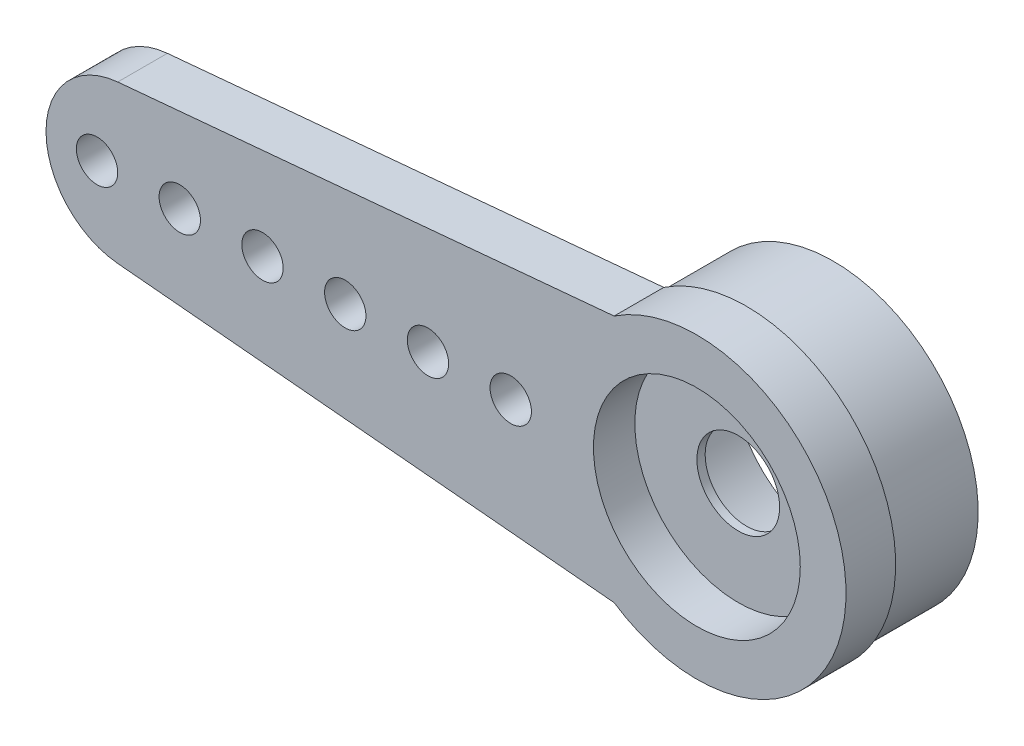
ISO-10303-21;
HEADER;
FILE_DESCRIPTION(('STEP AP214'),'2;1');
FILE_NAME('part.step','',(''),(''),'','','');
FILE_SCHEMA(('AUTOMOTIVE_DESIGN { 1 0 10303 214 1 1 1 1 }'));
ENDSEC;
DATA;
#1=APPLICATION_CONTEXT('core data for automotive mechanical design processes');
#2=APPLICATION_PROTOCOL_DEFINITION('international standard','automotive_design',2000,#1);
#3=PRODUCT_CONTEXT('',#1,'mechanical');
#4=PRODUCT('Part','Part','',(#3));
#5=PRODUCT_RELATED_PRODUCT_CATEGORY('part','',(#4));
#6=PRODUCT_DEFINITION_FORMATION('','',#4);
#7=PRODUCT_DEFINITION_CONTEXT('part definition',#1,'design');
#8=PRODUCT_DEFINITION('design','',#6,#7);
#9=PRODUCT_DEFINITION_SHAPE('','',#8);
#10=(LENGTH_UNIT() NAMED_UNIT(*) SI_UNIT(.MILLI.,.METRE.));
#11=(NAMED_UNIT(*) PLANE_ANGLE_UNIT() SI_UNIT($,.RADIAN.));
#12=(NAMED_UNIT(*) SI_UNIT($,.STERADIAN.) SOLID_ANGLE_UNIT());
#13=UNCERTAINTY_MEASURE_WITH_UNIT(LENGTH_MEASURE(1.E-05),#10,'distance_accuracy_value','');
#14=(GEOMETRIC_REPRESENTATION_CONTEXT(3) GLOBAL_UNCERTAINTY_ASSIGNED_CONTEXT((#13)) GLOBAL_UNIT_ASSIGNED_CONTEXT((#10,
#11,#12)) REPRESENTATION_CONTEXT('',''));
#15=CARTESIAN_POINT('',(0.,0.,0.));
#16=DIRECTION('',(0.,0.,1.));
#17=DIRECTION('',(1.,0.,0.));
#18=AXIS2_PLACEMENT_3D('',#15,#16,#17);
#19=CARTESIAN_POINT('',(0.,0.,-2.1));
#20=DIRECTION('',(0.,0.,1.));
#21=DIRECTION('',(1.,0.,0.));
#22=AXIS2_PLACEMENT_3D('',#19,#20,#21);
#23=CYLINDRICAL_SURFACE('',#22,1.);
#24=CARTESIAN_POINT('',(0.,0.,0.2));
#25=DIRECTION('',(0.,0.,1.));
#26=DIRECTION('',(1.,0.,0.));
#27=AXIS2_PLACEMENT_3D('',#24,#25,#26);
#28=CIRCLE('',#27,1.);
#29=CARTESIAN_POINT('',(1.,0.,0.2));
#30=VERTEX_POINT('',#29);
#31=EDGE_CURVE('E113',#30,#30,#28,.T.);
#32=ORIENTED_EDGE('',*,*,#31,.T.);
#33=EDGE_LOOP('',(#32));
#34=FACE_BOUND('',#33,.T.);
#35=CARTESIAN_POINT('',(0.,0.,0.));
#36=DIRECTION('',(0.,0.,-1.));
#37=DIRECTION('',(-1.,0.,0.));
#38=AXIS2_PLACEMENT_3D('',#35,#36,#37);
#39=CIRCLE('',#38,1.);
#40=CARTESIAN_POINT('',(-1.,0.,0.));
#41=VERTEX_POINT('',#40);
#42=EDGE_CURVE('E110',#41,#41,#39,.F.);
#43=ORIENTED_EDGE('',*,*,#42,.F.);
#44=EDGE_LOOP('',(#43));
#45=FACE_BOUND('',#44,.T.);
#46=ADVANCED_FACE('F36',(#34,#45),#23,.F.);
#47=CARTESIAN_POINT('',(-14.,1.9,1.2));
#48=DIRECTION('',(0.0912839495849539,-0.995824904563132,0.));
#49=DIRECTION('',(0.995824904563132,0.0912839495849539,0.));
#50=AXIS2_PLACEMENT_3D('',#47,#48,#49);
#51=PLANE('',#50);
#52=DIRECTION('',(-0.995824904563132,-0.0912839495849539,0.));
#53=VECTOR('',#52,1.);
#54=CARTESIAN_POINT('',(-14.,1.9,0.));
#55=LINE('',#54,#53);
#56=CARTESIAN_POINT('',(-2.,3.,0.));
#57=VERTEX_POINT('',#56);
#58=CARTESIAN_POINT('',(-14.,1.9,0.));
#59=VERTEX_POINT('',#58);
#60=EDGE_CURVE('E82',#57,#59,#55,.T.);
#61=ORIENTED_EDGE('',*,*,#60,.T.);
#62=DIRECTION('',(0.,0.,-1.));
#63=VECTOR('',#62,1.);
#64=CARTESIAN_POINT('',(-14.,1.9,1.2));
#65=LINE('',#64,#63);
#66=CARTESIAN_POINT('',(-14.,1.9,1.2));
#67=VERTEX_POINT('',#66);
#68=EDGE_CURVE('E107',#67,#59,#65,.T.);
#69=ORIENTED_EDGE('',*,*,#68,.F.);
#70=DIRECTION('',(-0.995824904563132,-0.0912839495849539,0.));
#71=VECTOR('',#70,1.);
#72=CARTESIAN_POINT('',(-14.,1.9,1.2));
#73=LINE('',#72,#71);
#74=CARTESIAN_POINT('',(-2.,3.,1.2));
#75=VERTEX_POINT('',#74);
#76=EDGE_CURVE('E100',#75,#67,#73,.T.);
#77=ORIENTED_EDGE('',*,*,#76,.F.);
#78=DIRECTION('',(0.,0.,-1.));
#79=VECTOR('',#78,1.);
#80=CARTESIAN_POINT('',(-2.,3.,1.2));
#81=LINE('',#80,#79);
#82=EDGE_CURVE('E46',#75,#57,#81,.T.);
#83=ORIENTED_EDGE('',*,*,#82,.T.);
#84=EDGE_LOOP('',(#61,#69,#77,#83));
#85=FACE_BOUND('',#84,.T.);
#86=ADVANCED_FACE('F38',(#85),#51,.F.);
#87=CARTESIAN_POINT('',(-13.8258333333333,0.,1.2));
#88=DIRECTION('',(0.,0.,-1.));
#89=DIRECTION('',(-1.,0.,0.));
#90=AXIS2_PLACEMENT_3D('',#87,#88,#89);
#91=CYLINDRICAL_SURFACE('',#90,1.90796593988933);
#92=CARTESIAN_POINT('',(-13.8258333333333,0.,0.));
#93=DIRECTION('',(0.,0.,1.));
#94=DIRECTION('',(1.,0.,0.));
#95=AXIS2_PLACEMENT_3D('',#92,#93,#94);
#96=CIRCLE('',#95,1.90796593988933);
#97=CARTESIAN_POINT('',(-14.,-1.9,0.));
#98=VERTEX_POINT('',#97);
#99=EDGE_CURVE('E68',#59,#98,#96,.T.);
#100=ORIENTED_EDGE('',*,*,#99,.T.);
#101=DIRECTION('',(0.,0.,-1.));
#102=VECTOR('',#101,1.);
#103=CARTESIAN_POINT('',(-14.,-1.9,1.2));
#104=LINE('',#103,#102);
#105=CARTESIAN_POINT('',(-14.,-1.9,1.2));
#106=VERTEX_POINT('',#105);
#107=EDGE_CURVE('E96',#106,#98,#104,.T.);
#108=ORIENTED_EDGE('',*,*,#107,.F.);
#109=CARTESIAN_POINT('',(-13.8258333333333,0.,1.2));
#110=DIRECTION('',(0.,0.,1.));
#111=DIRECTION('',(1.,0.,0.));
#112=AXIS2_PLACEMENT_3D('',#109,#110,#111);
#113=CIRCLE('',#112,1.90796593988933);
#114=EDGE_CURVE('E55',#67,#106,#113,.T.);
#115=ORIENTED_EDGE('',*,*,#114,.F.);
#116=ORIENTED_EDGE('',*,*,#68,.T.);
#117=EDGE_LOOP('',(#100,#108,#115,#116));
#118=FACE_BOUND('',#117,.T.);
#119=ADVANCED_FACE('F158',(#118),#91,.T.);
#120=CARTESIAN_POINT('',(-14.,-1.9,1.2));
#121=DIRECTION('',(0.0912839495849537,0.995824904563132,0.));
#122=DIRECTION('',(-0.995824904563133,0.0912839495849537,0.));
#123=AXIS2_PLACEMENT_3D('',#120,#121,#122);
#124=PLANE('',#123);
#125=DIRECTION('',(0.995824904563132,-0.0912839495849537,0.));
#126=VECTOR('',#125,1.);
#127=CARTESIAN_POINT('',(-14.,-1.9,0.));
#128=LINE('',#127,#126);
#129=CARTESIAN_POINT('',(-2.,-3.,0.));
#130=VERTEX_POINT('',#129);
#131=EDGE_CURVE('E80',#98,#130,#128,.T.);
#132=ORIENTED_EDGE('',*,*,#131,.T.);
#133=DIRECTION('',(0.,0.,-1.));
#134=VECTOR('',#133,1.);
#135=CARTESIAN_POINT('',(-2.,-3.,1.2));
#136=LINE('',#135,#134);
#137=CARTESIAN_POINT('',(-2.,-3.,1.2));
#138=VERTEX_POINT('',#137);
#139=EDGE_CURVE('E90',#138,#130,#136,.T.);
#140=ORIENTED_EDGE('',*,*,#139,.F.);
#141=DIRECTION('',(0.995824904563132,-0.0912839495849537,0.));
#142=VECTOR('',#141,1.);
#143=CARTESIAN_POINT('',(-14.,-1.9,1.2));
#144=LINE('',#143,#142);
#145=EDGE_CURVE('E97',#106,#138,#144,.T.);
#146=ORIENTED_EDGE('',*,*,#145,.F.);
#147=ORIENTED_EDGE('',*,*,#107,.T.);
#148=EDGE_LOOP('',(#132,#140,#146,#147));
#149=FACE_BOUND('',#148,.T.);
#150=ADVANCED_FACE('F99',(#149),#124,.F.);
#151=CARTESIAN_POINT('',(0.,6.75,1.2));
#152=DIRECTION('',(0.,0.,-1.));
#153=DIRECTION('',(-1.,0.,0.));
#154=AXIS2_PLACEMENT_3D('',#151,#152,#153);
#155=PLANE('',#154);
#156=CARTESIAN_POINT('',(-4.5,0.,1.2));
#157=DIRECTION('',(0.,0.,1.));
#158=DIRECTION('',(1.,0.,0.));
#159=AXIS2_PLACEMENT_3D('',#156,#157,#158);
#160=CIRCLE('',#159,0.5);
#161=CARTESIAN_POINT('',(-4.,0.,1.2));
#162=VERTEX_POINT('',#161);
#163=EDGE_CURVE('E119',#162,#162,#160,.T.);
#164=ORIENTED_EDGE('',*,*,#163,.F.);
#165=EDGE_LOOP('',(#164));
#166=FACE_BOUND('',#165,.T.);
#167=CARTESIAN_POINT('',(-6.5,0.,1.2));
#168=DIRECTION('',(0.,0.,1.));
#169=DIRECTION('',(1.,0.,0.));
#170=AXIS2_PLACEMENT_3D('',#167,#168,#169);
#171=CIRCLE('',#170,0.5);
#172=CARTESIAN_POINT('',(-6.,0.,1.2));
#173=VERTEX_POINT('',#172);
#174=EDGE_CURVE('E169',#173,#173,#171,.T.);
#175=ORIENTED_EDGE('',*,*,#174,.F.);
#176=EDGE_LOOP('',(#175));
#177=FACE_BOUND('',#176,.T.);
#178=CARTESIAN_POINT('',(-8.5,0.,1.2));
#179=DIRECTION('',(0.,0.,1.));
#180=DIRECTION('',(1.,0.,0.));
#181=AXIS2_PLACEMENT_3D('',#178,#179,#180);
#182=CIRCLE('',#181,0.500000000000001);
#183=CARTESIAN_POINT('',(-8.,0.,1.2));
#184=VERTEX_POINT('',#183);
#185=EDGE_CURVE('E172',#184,#184,#182,.T.);
#186=ORIENTED_EDGE('',*,*,#185,.F.);
#187=EDGE_LOOP('',(#186));
#188=FACE_BOUND('',#187,.T.);
#189=CARTESIAN_POINT('',(-10.5,0.,1.2));
#190=DIRECTION('',(0.,0.,1.));
#191=DIRECTION('',(1.,0.,0.));
#192=AXIS2_PLACEMENT_3D('',#189,#190,#191);
#193=CIRCLE('',#192,0.500000000000001);
#194=CARTESIAN_POINT('',(-10.,0.,1.2));
#195=VERTEX_POINT('',#194);
#196=EDGE_CURVE('E175',#195,#195,#193,.T.);
#197=ORIENTED_EDGE('',*,*,#196,.F.);
#198=EDGE_LOOP('',(#197));
#199=FACE_BOUND('',#198,.T.);
#200=CARTESIAN_POINT('',(-12.5,0.,1.2));
#201=DIRECTION('',(0.,0.,1.));
#202=DIRECTION('',(1.,0.,0.));
#203=AXIS2_PLACEMENT_3D('',#200,#201,#202);
#204=CIRCLE('',#203,0.500000000000001);
#205=CARTESIAN_POINT('',(-12.,0.,1.2));
#206=VERTEX_POINT('',#205);
#207=EDGE_CURVE('E165',#206,#206,#204,.T.);
#208=ORIENTED_EDGE('',*,*,#207,.F.);
#209=EDGE_LOOP('',(#208));
#210=FACE_BOUND('',#209,.T.);
#211=CARTESIAN_POINT('',(-14.5,0.,1.2));
#212=DIRECTION('',(0.,0.,1.));
#213=DIRECTION('',(1.,0.,0.));
#214=AXIS2_PLACEMENT_3D('',#211,#212,#213);
#215=CIRCLE('',#214,0.500000000000001);
#216=CARTESIAN_POINT('',(-14.,0.,1.2));
#217=VERTEX_POINT('',#216);
#218=EDGE_CURVE('E162',#217,#217,#215,.T.);
#219=ORIENTED_EDGE('',*,*,#218,.F.);
#220=EDGE_LOOP('',(#219));
#221=FACE_BOUND('',#220,.T.);
#222=CARTESIAN_POINT('',(0.,0.,1.2));
#223=DIRECTION('',(0.,0.,1.));
#224=DIRECTION('',(1.,0.,0.));
#225=AXIS2_PLACEMENT_3D('',#222,#223,#224);
#226=CIRCLE('',#225,2.5);
#227=CARTESIAN_POINT('',(2.5,0.,1.2));
#228=VERTEX_POINT('',#227);
#229=EDGE_CURVE('E145',#228,#228,#226,.T.);
#230=ORIENTED_EDGE('',*,*,#229,.F.);
#231=EDGE_LOOP('',(#230));
#232=FACE_BOUND('',#231,.T.);
#233=ORIENTED_EDGE('',*,*,#145,.T.);
#234=CARTESIAN_POINT('',(0.,0.,1.2));
#235=DIRECTION('',(0.,0.,-1.));
#236=DIRECTION('',(-1.,0.,0.));
#237=AXIS2_PLACEMENT_3D('',#234,#235,#236);
#238=CIRCLE('',#237,3.60555127546399);
#239=EDGE_CURVE('E86',#138,#75,#238,.F.);
#240=ORIENTED_EDGE('',*,*,#239,.T.);
#241=ORIENTED_EDGE('',*,*,#76,.T.);
#242=ORIENTED_EDGE('',*,*,#114,.T.);
#243=EDGE_LOOP('',(#233,#240,#241,#242));
#244=FACE_BOUND('',#243,.T.);
#245=ADVANCED_FACE('F159',(#166,#177,#188,#199,#210,#221,#232,#244),#155,.F.);
#246=CARTESIAN_POINT('',(0.,6.75,0.));
#247=DIRECTION('',(0.,0.,-1.));
#248=DIRECTION('',(-1.,0.,0.));
#249=AXIS2_PLACEMENT_3D('',#246,#247,#248);
#250=PLANE('',#249);
#251=CARTESIAN_POINT('',(0.,0.,0.));
#252=DIRECTION('',(0.,0.,1.));
#253=DIRECTION('',(1.,0.,0.));
#254=AXIS2_PLACEMENT_3D('',#251,#252,#253);
#255=CIRCLE('',#254,3.60555127546399);
#256=EDGE_CURVE('E75',#130,#57,#255,.T.);
#257=ORIENTED_EDGE('',*,*,#256,.F.);
#258=ORIENTED_EDGE('',*,*,#131,.F.);
#259=ORIENTED_EDGE('',*,*,#99,.F.);
#260=ORIENTED_EDGE('',*,*,#60,.F.);
#261=EDGE_LOOP('',(#257,#258,#259,#260));
#262=FACE_BOUND('',#261,.T.);
#263=CARTESIAN_POINT('',(-4.5,0.,0.));
#264=DIRECTION('',(0.,0.,-1.));
#265=DIRECTION('',(-1.,0.,0.));
#266=AXIS2_PLACEMENT_3D('',#263,#264,#265);
#267=CIRCLE('',#266,0.5);
#268=CARTESIAN_POINT('',(-5.,0.,0.));
#269=VERTEX_POINT('',#268);
#270=EDGE_CURVE('E40',#269,#269,#267,.T.);
#271=ORIENTED_EDGE('',*,*,#270,.F.);
#272=EDGE_LOOP('',(#271));
#273=FACE_BOUND('',#272,.T.);
#274=CARTESIAN_POINT('',(-6.5,0.,0.));
#275=DIRECTION('',(0.,0.,-1.));
#276=DIRECTION('',(-1.,0.,0.));
#277=AXIS2_PLACEMENT_3D('',#274,#275,#276);
#278=CIRCLE('',#277,0.5);
#279=CARTESIAN_POINT('',(-7.,0.,0.));
#280=VERTEX_POINT('',#279);
#281=EDGE_CURVE('E127',#280,#280,#278,.T.);
#282=ORIENTED_EDGE('',*,*,#281,.F.);
#283=EDGE_LOOP('',(#282));
#284=FACE_BOUND('',#283,.T.);
#285=CARTESIAN_POINT('',(-8.5,0.,0.));
#286=DIRECTION('',(0.,0.,-1.));
#287=DIRECTION('',(-1.,0.,0.));
#288=AXIS2_PLACEMENT_3D('',#285,#286,#287);
#289=CIRCLE('',#288,0.500000000000001);
#290=CARTESIAN_POINT('',(-9.,0.,0.));
#291=VERTEX_POINT('',#290);
#292=EDGE_CURVE('E125',#291,#291,#289,.T.);
#293=ORIENTED_EDGE('',*,*,#292,.F.);
#294=EDGE_LOOP('',(#293));
#295=FACE_BOUND('',#294,.T.);
#296=CARTESIAN_POINT('',(-10.5,0.,0.));
#297=DIRECTION('',(0.,0.,-1.));
#298=DIRECTION('',(-1.,0.,0.));
#299=AXIS2_PLACEMENT_3D('',#296,#297,#298);
#300=CIRCLE('',#299,0.500000000000001);
#301=CARTESIAN_POINT('',(-11.,0.,0.));
#302=VERTEX_POINT('',#301);
#303=EDGE_CURVE('E122',#302,#302,#300,.T.);
#304=ORIENTED_EDGE('',*,*,#303,.F.);
#305=EDGE_LOOP('',(#304));
#306=FACE_BOUND('',#305,.T.);
#307=CARTESIAN_POINT('',(-12.5,0.,0.));
#308=DIRECTION('',(0.,0.,-1.));
#309=DIRECTION('',(-1.,0.,0.));
#310=AXIS2_PLACEMENT_3D('',#307,#308,#309);
#311=CIRCLE('',#310,0.500000000000001);
#312=CARTESIAN_POINT('',(-13.,0.,0.));
#313=VERTEX_POINT('',#312);
#314=EDGE_CURVE('E118',#313,#313,#311,.T.);
#315=ORIENTED_EDGE('',*,*,#314,.F.);
#316=EDGE_LOOP('',(#315));
#317=FACE_BOUND('',#316,.T.);
#318=CARTESIAN_POINT('',(-14.5,0.,0.));
#319=DIRECTION('',(0.,0.,-1.));
#320=DIRECTION('',(-1.,0.,0.));
#321=AXIS2_PLACEMENT_3D('',#318,#319,#320);
#322=CIRCLE('',#321,0.500000000000001);
#323=CARTESIAN_POINT('',(-15.,0.,0.));
#324=VERTEX_POINT('',#323);
#325=EDGE_CURVE('E115',#324,#324,#322,.T.);
#326=ORIENTED_EDGE('',*,*,#325,.F.);
#327=EDGE_LOOP('',(#326));
#328=FACE_BOUND('',#327,.T.);
#329=CARTESIAN_POINT('',(0.,0.,0.));
#330=DIRECTION('',(0.,0.,-1.));
#331=DIRECTION('',(-1.,0.,0.));
#332=AXIS2_PLACEMENT_3D('',#329,#330,#331);
#333=CIRCLE('',#332,3.5);
#334=CARTESIAN_POINT('',(-3.5,0.,0.));
#335=VERTEX_POINT('',#334);
#336=EDGE_CURVE('E11',#335,#335,#333,.T.);
#337=ORIENTED_EDGE('',*,*,#336,.F.);
#338=EDGE_LOOP('',(#337));
#339=FACE_BOUND('',#338,.T.);
#340=ADVANCED_FACE('F77',(#262,#273,#284,#295,#306,#317,#328,#339),#250,.T.);
#341=CARTESIAN_POINT('',(0.,0.,-2.1));
#342=DIRECTION('',(0.,0.,1.));
#343=DIRECTION('',(1.,0.,0.));
#344=AXIS2_PLACEMENT_3D('',#341,#342,#343);
#345=CYLINDRICAL_SURFACE('',#344,3.5);
#346=CARTESIAN_POINT('',(0.,0.,-2.1));
#347=DIRECTION('',(0.,0.,-1.));
#348=DIRECTION('',(-1.,0.,0.));
#349=AXIS2_PLACEMENT_3D('',#346,#347,#348);
#350=CIRCLE('',#349,3.5);
#351=CARTESIAN_POINT('',(-3.5,0.,-2.1));
#352=VERTEX_POINT('',#351);
#353=EDGE_CURVE('E149',#352,#352,#350,.T.);
#354=ORIENTED_EDGE('',*,*,#353,.F.);
#355=EDGE_LOOP('',(#354));
#356=FACE_BOUND('',#355,.T.);
#357=ORIENTED_EDGE('',*,*,#336,.T.);
#358=EDGE_LOOP('',(#357));
#359=FACE_BOUND('',#358,.T.);
#360=ADVANCED_FACE('F204',(#356,#359),#345,.T.);
#361=CARTESIAN_POINT('',(0.,0.,-2.1));
#362=DIRECTION('',(0.,0.,-1.));
#363=DIRECTION('',(-1.,0.,0.));
#364=AXIS2_PLACEMENT_3D('',#361,#362,#363);
#365=PLANE('',#364);
#366=CARTESIAN_POINT('',(0.,0.,-2.1));
#367=DIRECTION('',(0.,0.,-1.));
#368=DIRECTION('',(-1.,0.,0.));
#369=AXIS2_PLACEMENT_3D('',#366,#367,#368);
#370=CIRCLE('',#369,2.45);
#371=CARTESIAN_POINT('',(-2.45,0.,-2.1));
#372=VERTEX_POINT('',#371);
#373=EDGE_CURVE('E132',#372,#372,#370,.T.);
#374=ORIENTED_EDGE('',*,*,#373,.F.);
#375=EDGE_LOOP('',(#374));
#376=FACE_BOUND('',#375,.T.);
#377=ORIENTED_EDGE('',*,*,#353,.T.);
#378=EDGE_LOOP('',(#377));
#379=FACE_BOUND('',#378,.T.);
#380=ADVANCED_FACE('F194',(#376,#379),#365,.T.);
#381=CARTESIAN_POINT('',(0.,0.,0.2));
#382=DIRECTION('',(0.,0.,1.));
#383=DIRECTION('',(1.,0.,0.));
#384=AXIS2_PLACEMENT_3D('',#381,#382,#383);
#385=CYLINDRICAL_SURFACE('',#384,2.5);
#386=CARTESIAN_POINT('',(0.,0.,0.2));
#387=DIRECTION('',(0.,0.,1.));
#388=DIRECTION('',(1.,0.,0.));
#389=AXIS2_PLACEMENT_3D('',#386,#387,#388);
#390=CIRCLE('',#389,2.5);
#391=CARTESIAN_POINT('',(2.5,0.,0.2));
#392=VERTEX_POINT('',#391);
#393=EDGE_CURVE('E146',#392,#392,#390,.T.);
#394=ORIENTED_EDGE('',*,*,#393,.F.);
#395=EDGE_LOOP('',(#394));
#396=FACE_BOUND('',#395,.T.);
#397=ORIENTED_EDGE('',*,*,#229,.T.);
#398=EDGE_LOOP('',(#397));
#399=FACE_BOUND('',#398,.T.);
#400=ADVANCED_FACE('F191',(#396,#399),#385,.F.);
#401=CARTESIAN_POINT('',(0.,0.,0.2));
#402=DIRECTION('',(0.,0.,1.));
#403=DIRECTION('',(1.,0.,0.));
#404=AXIS2_PLACEMENT_3D('',#401,#402,#403);
#405=PLANE('',#404);
#406=ORIENTED_EDGE('',*,*,#31,.F.);
#407=EDGE_LOOP('',(#406));
#408=FACE_BOUND('',#407,.T.);
#409=ORIENTED_EDGE('',*,*,#393,.T.);
#410=EDGE_LOOP('',(#409));
#411=FACE_BOUND('',#410,.T.);
#412=ADVANCED_FACE('F193',(#408,#411),#405,.T.);
#413=CARTESIAN_POINT('',(0.,0.,0.));
#414=DIRECTION('',(0.,0.,-1.));
#415=DIRECTION('',(-1.,0.,0.));
#416=AXIS2_PLACEMENT_3D('',#413,#414,#415);
#417=PLANE('',#416);
#418=CARTESIAN_POINT('',(0.,0.,0.));
#419=DIRECTION('',(0.,0.,-1.));
#420=DIRECTION('',(-1.,0.,0.));
#421=AXIS2_PLACEMENT_3D('',#418,#419,#420);
#422=CIRCLE('',#421,2.45);
#423=CARTESIAN_POINT('',(-2.45,0.,0.));
#424=VERTEX_POINT('',#423);
#425=EDGE_CURVE('E114',#424,#424,#422,.T.);
#426=ORIENTED_EDGE('',*,*,#425,.T.);
#427=EDGE_LOOP('',(#426));
#428=FACE_BOUND('',#427,.T.);
#429=ORIENTED_EDGE('',*,*,#42,.T.);
#430=EDGE_LOOP('',(#429));
#431=FACE_BOUND('',#430,.T.);
#432=ADVANCED_FACE('F201',(#428,#431),#417,.T.);
#433=CARTESIAN_POINT('',(0.,0.,0.));
#434=DIRECTION('',(0.,0.,-1.));
#435=DIRECTION('',(-1.,0.,0.));
#436=AXIS2_PLACEMENT_3D('',#433,#434,#435);
#437=CYLINDRICAL_SURFACE('',#436,2.45);
#438=ORIENTED_EDGE('',*,*,#425,.F.);
#439=EDGE_LOOP('',(#438));
#440=FACE_BOUND('',#439,.T.);
#441=ORIENTED_EDGE('',*,*,#373,.T.);
#442=EDGE_LOOP('',(#441));
#443=FACE_BOUND('',#442,.T.);
#444=ADVANCED_FACE('F216',(#440,#443),#437,.F.);
#445=CARTESIAN_POINT('',(-14.5,0.,-2.1));
#446=DIRECTION('',(0.,0.,1.));
#447=DIRECTION('',(1.,0.,0.));
#448=AXIS2_PLACEMENT_3D('',#445,#446,#447);
#449=CYLINDRICAL_SURFACE('',#448,0.500000000000001);
#450=ORIENTED_EDGE('',*,*,#325,.T.);
#451=EDGE_LOOP('',(#450));
#452=FACE_BOUND('',#451,.T.);
#453=ORIENTED_EDGE('',*,*,#218,.T.);
#454=EDGE_LOOP('',(#453));
#455=FACE_BOUND('',#454,.T.);
#456=ADVANCED_FACE('F219',(#452,#455),#449,.F.);
#457=CARTESIAN_POINT('',(-12.5,0.,-2.1));
#458=DIRECTION('',(0.,0.,1.));
#459=DIRECTION('',(1.,0.,0.));
#460=AXIS2_PLACEMENT_3D('',#457,#458,#459);
#461=CYLINDRICAL_SURFACE('',#460,0.500000000000001);
#462=ORIENTED_EDGE('',*,*,#314,.T.);
#463=EDGE_LOOP('',(#462));
#464=FACE_BOUND('',#463,.T.);
#465=ORIENTED_EDGE('',*,*,#207,.T.);
#466=EDGE_LOOP('',(#465));
#467=FACE_BOUND('',#466,.T.);
#468=ADVANCED_FACE('F181',(#464,#467),#461,.F.);
#469=CARTESIAN_POINT('',(-10.5,0.,-2.1));
#470=DIRECTION('',(0.,0.,1.));
#471=DIRECTION('',(1.,0.,0.));
#472=AXIS2_PLACEMENT_3D('',#469,#470,#471);
#473=CYLINDRICAL_SURFACE('',#472,0.500000000000001);
#474=ORIENTED_EDGE('',*,*,#303,.T.);
#475=EDGE_LOOP('',(#474));
#476=FACE_BOUND('',#475,.T.);
#477=ORIENTED_EDGE('',*,*,#196,.T.);
#478=EDGE_LOOP('',(#477));
#479=FACE_BOUND('',#478,.T.);
#480=ADVANCED_FACE('F229',(#476,#479),#473,.F.);
#481=CARTESIAN_POINT('',(-8.5,0.,-2.1));
#482=DIRECTION('',(0.,0.,1.));
#483=DIRECTION('',(1.,0.,0.));
#484=AXIS2_PLACEMENT_3D('',#481,#482,#483);
#485=CYLINDRICAL_SURFACE('',#484,0.500000000000001);
#486=ORIENTED_EDGE('',*,*,#292,.T.);
#487=EDGE_LOOP('',(#486));
#488=FACE_BOUND('',#487,.T.);
#489=ORIENTED_EDGE('',*,*,#185,.T.);
#490=EDGE_LOOP('',(#489));
#491=FACE_BOUND('',#490,.T.);
#492=ADVANCED_FACE('F233',(#488,#491),#485,.F.);
#493=CARTESIAN_POINT('',(-6.5,0.,-2.1));
#494=DIRECTION('',(0.,0.,1.));
#495=DIRECTION('',(1.,0.,0.));
#496=AXIS2_PLACEMENT_3D('',#493,#494,#495);
#497=CYLINDRICAL_SURFACE('',#496,0.5);
#498=ORIENTED_EDGE('',*,*,#281,.T.);
#499=EDGE_LOOP('',(#498));
#500=FACE_BOUND('',#499,.T.);
#501=ORIENTED_EDGE('',*,*,#174,.T.);
#502=EDGE_LOOP('',(#501));
#503=FACE_BOUND('',#502,.T.);
#504=ADVANCED_FACE('F237',(#500,#503),#497,.F.);
#505=CARTESIAN_POINT('',(-4.5,0.,-2.1));
#506=DIRECTION('',(0.,0.,1.));
#507=DIRECTION('',(1.,0.,0.));
#508=AXIS2_PLACEMENT_3D('',#505,#506,#507);
#509=CYLINDRICAL_SURFACE('',#508,0.5);
#510=ORIENTED_EDGE('',*,*,#270,.T.);
#511=EDGE_LOOP('',(#510));
#512=FACE_BOUND('',#511,.T.);
#513=ORIENTED_EDGE('',*,*,#163,.T.);
#514=EDGE_LOOP('',(#513));
#515=FACE_BOUND('',#514,.T.);
#516=ADVANCED_FACE('F241',(#512,#515),#509,.F.);
#517=CARTESIAN_POINT('',(0.,0.,10.));
#518=DIRECTION('',(0.,0.,-1.));
#519=DIRECTION('',(-1.,0.,0.));
#520=AXIS2_PLACEMENT_3D('',#517,#518,#519);
#521=CYLINDRICAL_SURFACE('',#520,3.60555127546399);
#522=ORIENTED_EDGE('',*,*,#239,.F.);
#523=ORIENTED_EDGE('',*,*,#139,.T.);
#524=ORIENTED_EDGE('',*,*,#256,.T.);
#525=ORIENTED_EDGE('',*,*,#82,.F.);
#526=EDGE_LOOP('',(#522,#523,#524,#525));
#527=FACE_BOUND('',#526,.T.);
#528=ADVANCED_FACE('F91',(#527),#521,.T.);
#529=CLOSED_SHELL('',(#46,#86,#119,#150,#245,#340,#360,#380,#400,#412,#432,#444,#456,#468,#480,
#492,#504,#516,#528));
#530=MANIFOLD_SOLID_BREP('B2',#529);
#531=ADVANCED_BREP_SHAPE_REPRESENTATION('',(#18,#530),#14);
#532=SHAPE_DEFINITION_REPRESENTATION(#9,#531);
ENDSEC;
END-ISO-10303-21;
